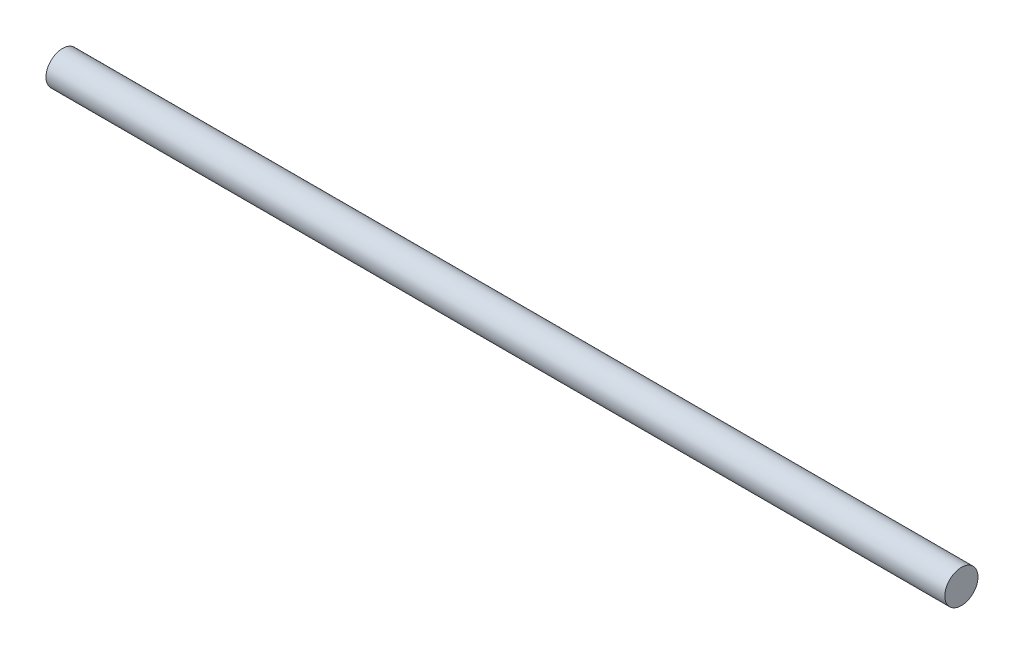
ISO-10303-21;
HEADER;
FILE_DESCRIPTION(('STEP AP214'),'2;1');
FILE_NAME('part.step','',(''),(''),'','','');
FILE_SCHEMA(('AUTOMOTIVE_DESIGN { 1 0 10303 214 1 1 1 1 }'));
ENDSEC;
DATA;
#1=APPLICATION_CONTEXT('core data for automotive mechanical design processes');
#2=APPLICATION_PROTOCOL_DEFINITION('international standard','automotive_design',2000,#1);
#3=PRODUCT_CONTEXT('',#1,'mechanical');
#4=PRODUCT('Part','Part','',(#3));
#5=PRODUCT_RELATED_PRODUCT_CATEGORY('part','',(#4));
#6=PRODUCT_DEFINITION_FORMATION('','',#4);
#7=PRODUCT_DEFINITION_CONTEXT('part definition',#1,'design');
#8=PRODUCT_DEFINITION('design','',#6,#7);
#9=PRODUCT_DEFINITION_SHAPE('','',#8);
#10=(LENGTH_UNIT() NAMED_UNIT(*) SI_UNIT(.MILLI.,.METRE.));
#11=(NAMED_UNIT(*) PLANE_ANGLE_UNIT() SI_UNIT($,.RADIAN.));
#12=(NAMED_UNIT(*) SI_UNIT($,.STERADIAN.) SOLID_ANGLE_UNIT());
#13=UNCERTAINTY_MEASURE_WITH_UNIT(LENGTH_MEASURE(1.E-05),#10,'distance_accuracy_value','');
#14=(GEOMETRIC_REPRESENTATION_CONTEXT(3) GLOBAL_UNCERTAINTY_ASSIGNED_CONTEXT((#13)) GLOBAL_UNIT_ASSIGNED_CONTEXT((#10,
#11,#12)) REPRESENTATION_CONTEXT('',''));
#15=CARTESIAN_POINT('',(0.,0.,0.));
#16=DIRECTION('',(0.,0.,1.));
#17=DIRECTION('',(1.,0.,0.));
#18=AXIS2_PLACEMENT_3D('',#15,#16,#17);
#19=CARTESIAN_POINT('',(558.8,0.,0.));
#20=DIRECTION('',(-1.,0.,0.));
#21=DIRECTION('',(0.,0.,1.));
#22=AXIS2_PLACEMENT_3D('',#19,#20,#21);
#23=CYLINDRICAL_SURFACE('',#22,10.31875);
#24=CARTESIAN_POINT('',(558.8,0.,0.));
#25=DIRECTION('',(1.,0.,0.));
#26=DIRECTION('',(0.,0.,-1.));
#27=AXIS2_PLACEMENT_3D('',#24,#25,#26);
#28=CIRCLE('',#27,10.31875);
#29=CARTESIAN_POINT('',(558.8,0.,-10.31875));
#30=VERTEX_POINT('',#29);
#31=EDGE_CURVE('E10',#30,#30,#28,.T.);
#32=ORIENTED_EDGE('',*,*,#31,.F.);
#33=EDGE_LOOP('',(#32));
#34=FACE_BOUND('',#33,.T.);
#35=CARTESIAN_POINT('',(0.,0.,0.));
#36=DIRECTION('',(1.,0.,0.));
#37=DIRECTION('',(0.,0.,-1.));
#38=AXIS2_PLACEMENT_3D('',#35,#36,#37);
#39=CIRCLE('',#38,10.31875);
#40=CARTESIAN_POINT('',(0.,0.,-10.31875));
#41=VERTEX_POINT('',#40);
#42=EDGE_CURVE('E34',#41,#41,#39,.T.);
#43=ORIENTED_EDGE('',*,*,#42,.T.);
#44=EDGE_LOOP('',(#43));
#45=FACE_BOUND('',#44,.T.);
#46=ADVANCED_FACE('F31',(#34,#45),#23,.T.);
#47=CARTESIAN_POINT('',(558.8,0.,0.));
#48=DIRECTION('',(1.,0.,0.));
#49=DIRECTION('',(0.,0.,-1.));
#50=AXIS2_PLACEMENT_3D('',#47,#48,#49);
#51=PLANE('',#50);
#52=ORIENTED_EDGE('',*,*,#31,.T.);
#53=EDGE_LOOP('',(#52));
#54=FACE_BOUND('',#53,.T.);
#55=ADVANCED_FACE('F46',(#54),#51,.T.);
#56=CARTESIAN_POINT('',(0.,0.,0.));
#57=DIRECTION('',(1.,0.,0.));
#58=DIRECTION('',(0.,0.,-1.));
#59=AXIS2_PLACEMENT_3D('',#56,#57,#58);
#60=PLANE('',#59);
#61=ORIENTED_EDGE('',*,*,#42,.F.);
#62=EDGE_LOOP('',(#61));
#63=FACE_BOUND('',#62,.T.);
#64=ADVANCED_FACE('F44',(#63),#60,.F.);
#65=CLOSED_SHELL('',(#46,#55,#64));
#66=MANIFOLD_SOLID_BREP('B2',#65);
#67=ADVANCED_BREP_SHAPE_REPRESENTATION('',(#18,#66),#14);
#68=SHAPE_DEFINITION_REPRESENTATION(#9,#67);
ENDSEC;
END-ISO-10303-21;
